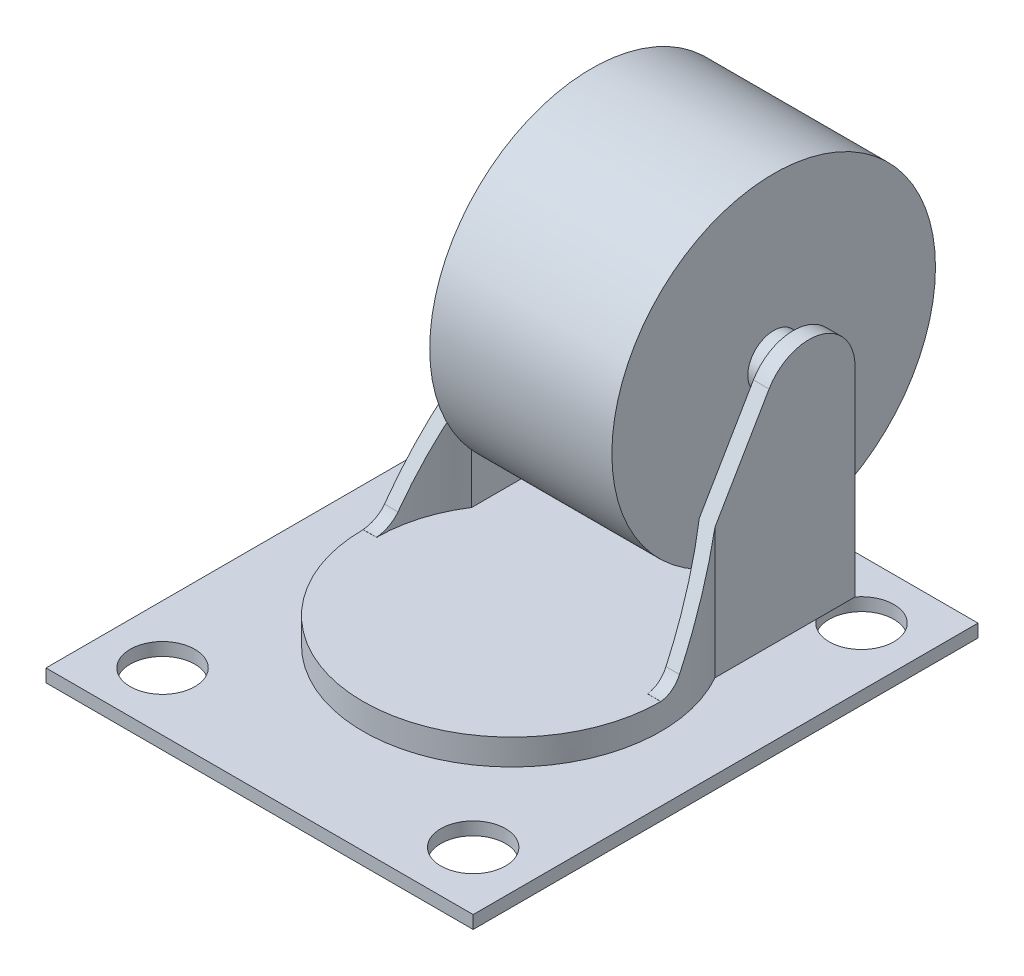
ISO-10303-21;
HEADER;
FILE_DESCRIPTION(('STEP AP214'),'2;1');
FILE_NAME('part.step','',(''),(''),'','','');
FILE_SCHEMA(('AUTOMOTIVE_DESIGN { 1 0 10303 214 1 1 1 1 }'));
ENDSEC;
DATA;
#1=APPLICATION_CONTEXT('core data for automotive mechanical design processes');
#2=APPLICATION_PROTOCOL_DEFINITION('international standard','automotive_design',2000,#1);
#3=PRODUCT_CONTEXT('',#1,'mechanical');
#4=PRODUCT('Part','Part','',(#3));
#5=PRODUCT_RELATED_PRODUCT_CATEGORY('part','',(#4));
#6=PRODUCT_DEFINITION_FORMATION('','',#4);
#7=PRODUCT_DEFINITION_CONTEXT('part definition',#1,'design');
#8=PRODUCT_DEFINITION('design','',#6,#7);
#9=PRODUCT_DEFINITION_SHAPE('','',#8);
#10=(LENGTH_UNIT() NAMED_UNIT(*) SI_UNIT(.MILLI.,.METRE.));
#11=(NAMED_UNIT(*) PLANE_ANGLE_UNIT() SI_UNIT($,.RADIAN.));
#12=(NAMED_UNIT(*) SI_UNIT($,.STERADIAN.) SOLID_ANGLE_UNIT());
#13=UNCERTAINTY_MEASURE_WITH_UNIT(LENGTH_MEASURE(1.E-05),#10,'distance_accuracy_value','');
#14=(GEOMETRIC_REPRESENTATION_CONTEXT(3) GLOBAL_UNCERTAINTY_ASSIGNED_CONTEXT((#13)) GLOBAL_UNIT_ASSIGNED_CONTEXT((#10,
#11,#12)) REPRESENTATION_CONTEXT('',''));
#15=CARTESIAN_POINT('',(0.,0.,0.));
#16=DIRECTION('',(0.,0.,1.));
#17=DIRECTION('',(1.,0.,0.));
#18=AXIS2_PLACEMENT_3D('',#15,#16,#17);
#19=CARTESIAN_POINT('',(-9.99999999999999,3.,-5.67890834580028));
#20=DIRECTION('',(1.,0.,0.));
#21=DIRECTION('',(0.,0.,-1.));
#22=AXIS2_PLACEMENT_3D('',#19,#20,#21);
#23=PLANE('',#22);
#24=CARTESIAN_POINT('',(-9.99999999999999,16.4364907092457,-12.9364907092474));
#25=DIRECTION('',(1.,0.,0.));
#26=DIRECTION('',(0.,0.,-1.));
#27=AXIS2_PLACEMENT_3D('',#24,#25,#26);
#28=CIRCLE('',#27,3.56350929075368);
#29=CARTESIAN_POINT('',(-10.0000000000001,16.4364907092457,-16.5000000000011));
#30=VERTEX_POINT('',#29);
#31=CARTESIAN_POINT('',(-9.99999999999999,18.2335634900353,-9.85929590133667));
#32=VERTEX_POINT('',#31);
#33=EDGE_CURVE('E184',#30,#32,#28,.T.);
#34=ORIENTED_EDGE('',*,*,#33,.F.);
#35=DIRECTION('',(0.,-1.,0.));
#36=VECTOR('',#35,1.);
#37=CARTESIAN_POINT('',(-9.99999999999999,3.,-16.5));
#38=LINE('',#37,#36);
#39=CARTESIAN_POINT('',(-10.0000000000001,1.,-16.5));
#40=VERTEX_POINT('',#39);
#41=EDGE_CURVE('E197',#30,#40,#38,.T.);
#42=ORIENTED_EDGE('',*,*,#41,.T.);
#43=DIRECTION('',(0.,0.,1.));
#44=VECTOR('',#43,1.);
#45=CARTESIAN_POINT('',(-9.99999999999999,1.,-5.67890834580028));
#46=LINE('',#45,#44);
#47=CARTESIAN_POINT('',(-9.99999999999999,1.,-13.4999999999998));
#48=VERTEX_POINT('',#47);
#49=EDGE_CURVE('E708',#40,#48,#46,.T.);
#50=ORIENTED_EDGE('',*,*,#49,.T.);
#51=CARTESIAN_POINT('',(-9.99999999999999,1.,-5.67890834580029));
#52=VERTEX_POINT('',#51);
#53=EDGE_CURVE('E279',#48,#52,#46,.T.);
#54=ORIENTED_EDGE('',*,*,#53,.T.);
#55=DIRECTION('',(0.,-1.,0.));
#56=VECTOR('',#55,1.);
#57=CARTESIAN_POINT('',(-9.99999999999999,3.,-5.67890834580029));
#58=LINE('',#57,#56);
#59=CARTESIAN_POINT('',(-9.99999999999999,11.0753298233394,-5.67890834580029));
#60=VERTEX_POINT('',#59);
#61=EDGE_CURVE('E219',#60,#52,#58,.T.);
#62=ORIENTED_EDGE('',*,*,#61,.F.);
#63=DIRECTION('',(0.,0.863529334943845,-0.504298609646547));
#64=VECTOR('',#63,1.);
#65=CARTESIAN_POINT('',(-9.99999999999999,5.0536943628195,-2.16229082320507));
#66=LINE('',#65,#64);
#67=EDGE_CURVE('E200',#60,#32,#66,.T.);
#68=ORIENTED_EDGE('',*,*,#67,.T.);
#69=EDGE_LOOP('',(#34,#42,#50,#54,#62,#68));
#70=FACE_BOUND('',#69,.T.);
#71=ADVANCED_FACE('F36',(#70),#23,.F.);
#72=CARTESIAN_POINT('',(10.,3.,-5.67890834580026));
#73=DIRECTION('',(-1.,0.,0.));
#74=DIRECTION('',(0.,0.,1.));
#75=AXIS2_PLACEMENT_3D('',#72,#73,#74);
#76=PLANE('',#75);
#77=DIRECTION('',(0.,-1.,0.));
#78=VECTOR('',#77,1.);
#79=CARTESIAN_POINT('',(10.,3.,-16.5));
#80=LINE('',#79,#78);
#81=CARTESIAN_POINT('',(10.,16.4364907092457,-16.5000000000011));
#82=VERTEX_POINT('',#81);
#83=CARTESIAN_POINT('',(10.,1.,-16.5));
#84=VERTEX_POINT('',#83);
#85=EDGE_CURVE('E208',#82,#84,#80,.T.);
#86=ORIENTED_EDGE('',*,*,#85,.F.);
#87=CARTESIAN_POINT('',(10.,16.4364907092457,-12.9364907092474));
#88=DIRECTION('',(-1.,0.,0.));
#89=DIRECTION('',(0.,0.,1.));
#90=AXIS2_PLACEMENT_3D('',#87,#88,#89);
#91=CIRCLE('',#90,3.56350929075368);
#92=CARTESIAN_POINT('',(10.,18.2335634900353,-9.85929590133667));
#93=VERTEX_POINT('',#92);
#94=EDGE_CURVE('E191',#93,#82,#91,.T.);
#95=ORIENTED_EDGE('',*,*,#94,.F.);
#96=DIRECTION('',(0.,-0.863529334943845,0.504298609646547));
#97=VECTOR('',#96,1.);
#98=CARTESIAN_POINT('',(10.,5.05369436281949,-2.16229082320507));
#99=LINE('',#98,#97);
#100=CARTESIAN_POINT('',(10.,11.0753298233393,-5.67890834580026));
#101=VERTEX_POINT('',#100);
#102=EDGE_CURVE('E735',#93,#101,#99,.T.);
#103=ORIENTED_EDGE('',*,*,#102,.T.);
#104=DIRECTION('',(0.,-1.,0.));
#105=VECTOR('',#104,1.);
#106=CARTESIAN_POINT('',(10.,3.,-5.67890834580026));
#107=LINE('',#106,#105);
#108=CARTESIAN_POINT('',(10.,1.,-5.67890834580026));
#109=VERTEX_POINT('',#108);
#110=EDGE_CURVE('E211',#101,#109,#107,.T.);
#111=ORIENTED_EDGE('',*,*,#110,.T.);
#112=DIRECTION('',(0.,0.,-1.));
#113=VECTOR('',#112,1.);
#114=CARTESIAN_POINT('',(10.,1.,-5.67890834580026));
#115=LINE('',#114,#113);
#116=CARTESIAN_POINT('',(10.,1.,-13.5));
#117=VERTEX_POINT('',#116);
#118=EDGE_CURVE('E713',#109,#117,#115,.T.);
#119=ORIENTED_EDGE('',*,*,#118,.T.);
#120=EDGE_CURVE('E712',#117,#84,#115,.T.);
#121=ORIENTED_EDGE('',*,*,#120,.T.);
#122=EDGE_LOOP('',(#86,#95,#103,#111,#119,#121));
#123=FACE_BOUND('',#122,.T.);
#124=ADVANCED_FACE('F346',(#123),#76,.F.);
#125=CARTESIAN_POINT('',(-8.79173124750535,-13.7207870519226,-16.5));
#126=DIRECTION('',(1.,0.,0.));
#127=DIRECTION('',(0.,0.,-1.));
#128=AXIS2_PLACEMENT_3D('',#125,#126,#127);
#129=PLANE('',#128);
#130=CARTESIAN_POINT('',(-8.79173124750535,17.,-13.1796479506689));
#131=DIRECTION('',(1.,0.,0.));
#132=DIRECTION('',(0.,0.,-1.));
#133=AXIS2_PLACEMENT_3D('',#130,#131,#132);
#134=CIRCLE('',#133,2.);
#135=CARTESIAN_POINT('',(-8.79173124750535,17.,-15.1796479506689));
#136=VERTEX_POINT('',#135);
#137=EDGE_CURVE('E681',#136,#136,#134,.T.);
#138=ORIENTED_EDGE('',*,*,#137,.F.);
#139=EDGE_LOOP('',(#138));
#140=FACE_BOUND('',#139,.T.);
#141=DIRECTION('',(0.,1.,0.));
#142=VECTOR('',#141,1.);
#143=CARTESIAN_POINT('',(-8.79173124750535,-13.7207870519226,-16.5));
#144=LINE('',#143,#142);
#145=CARTESIAN_POINT('',(-8.79173124750535,3.,-16.5));
#146=VERTEX_POINT('',#145);
#147=CARTESIAN_POINT('',(-8.79173124750535,16.4364907092457,-16.5000000000011));
#148=VERTEX_POINT('',#147);
#149=EDGE_CURVE('E683',#146,#148,#144,.T.);
#150=ORIENTED_EDGE('',*,*,#149,.T.);
#151=CARTESIAN_POINT('',(-8.79173124750535,16.4364907092457,-12.9364907092474));
#152=DIRECTION('',(1.,0.,0.));
#153=DIRECTION('',(0.,0.,-1.));
#154=AXIS2_PLACEMENT_3D('',#151,#152,#153);
#155=CIRCLE('',#154,3.56350929075368);
#156=CARTESIAN_POINT('',(-8.79173124750535,18.2335634900353,-9.85929590133667));
#157=VERTEX_POINT('',#156);
#158=EDGE_CURVE('E186',#148,#157,#155,.T.);
#159=ORIENTED_EDGE('',*,*,#158,.T.);
#160=DIRECTION('',(0.,0.863529334943845,-0.504298609646547));
#161=VECTOR('',#160,1.);
#162=CARTESIAN_POINT('',(-8.79173124750535,-2.7023781549703,2.36723287536569));
#163=LINE('',#162,#161);
#164=CARTESIAN_POINT('',(-8.79173124750535,11.0753298233394,-5.67890834580029));
#165=VERTEX_POINT('',#164);
#166=EDGE_CURVE('E779',#165,#157,#163,.T.);
#167=ORIENTED_EDGE('',*,*,#166,.F.);
#168=DIRECTION('',(0.,1.,0.));
#169=VECTOR('',#168,1.);
#170=CARTESIAN_POINT('',(-8.79173124750535,-13.7207870519226,-5.67890834580029));
#171=LINE('',#170,#169);
#172=CARTESIAN_POINT('',(-8.79173124750535,3.,-5.67890834580029));
#173=VERTEX_POINT('',#172);
#174=EDGE_CURVE('E690',#173,#165,#171,.T.);
#175=ORIENTED_EDGE('',*,*,#174,.F.);
#176=DIRECTION('',(0.,0.,1.));
#177=VECTOR('',#176,1.);
#178=CARTESIAN_POINT('',(-8.79173124750535,3.,-16.5));
#179=LINE('',#178,#177);
#180=EDGE_CURVE('E688',#146,#173,#179,.T.);
#181=ORIENTED_EDGE('',*,*,#180,.F.);
#182=EDGE_LOOP('',(#150,#159,#167,#175,#181));
#183=FACE_BOUND('',#182,.T.);
#184=ADVANCED_FACE('F329',(#140,#183),#129,.T.);
#185=CARTESIAN_POINT('',(8.79173124750535,-13.7207870519226,-16.5));
#186=DIRECTION('',(-1.,0.,0.));
#187=DIRECTION('',(0.,0.,1.));
#188=AXIS2_PLACEMENT_3D('',#185,#186,#187);
#189=PLANE('',#188);
#190=CARTESIAN_POINT('',(8.79173124750535,17.,-13.1796479506689));
#191=DIRECTION('',(-1.,0.,0.));
#192=DIRECTION('',(0.,0.,1.));
#193=AXIS2_PLACEMENT_3D('',#190,#191,#192);
#194=CIRCLE('',#193,2.);
#195=CARTESIAN_POINT('',(8.79173124750535,17.,-11.1796479506689));
#196=VERTEX_POINT('',#195);
#197=EDGE_CURVE('E11',#196,#196,#194,.T.);
#198=ORIENTED_EDGE('',*,*,#197,.F.);
#199=EDGE_LOOP('',(#198));
#200=FACE_BOUND('',#199,.T.);
#201=DIRECTION('',(0.,-0.863529334943845,0.504298609646547));
#202=VECTOR('',#201,1.);
#203=CARTESIAN_POINT('',(8.79173124750535,-2.7023781549703,2.36723287536569));
#204=LINE('',#203,#202);
#205=CARTESIAN_POINT('',(8.79173124750535,18.2335634900353,-9.85929590133667));
#206=VERTEX_POINT('',#205);
#207=CARTESIAN_POINT('',(8.79173124750535,11.0753298233394,-5.67890834580029));
#208=VERTEX_POINT('',#207);
#209=EDGE_CURVE('E280',#206,#208,#204,.T.);
#210=ORIENTED_EDGE('',*,*,#209,.F.);
#211=CARTESIAN_POINT('',(8.79173124750535,16.4364907092457,-12.9364907092474));
#212=DIRECTION('',(-1.,0.,0.));
#213=DIRECTION('',(0.,0.,1.));
#214=AXIS2_PLACEMENT_3D('',#211,#212,#213);
#215=CIRCLE('',#214,3.56350929075368);
#216=CARTESIAN_POINT('',(8.79173124750535,16.4364907092457,-16.5000000000011));
#217=VERTEX_POINT('',#216);
#218=EDGE_CURVE('E59',#206,#217,#215,.T.);
#219=ORIENTED_EDGE('',*,*,#218,.T.);
#220=DIRECTION('',(0.,1.,0.));
#221=VECTOR('',#220,1.);
#222=CARTESIAN_POINT('',(8.79173124750535,-13.7207870519226,-16.5));
#223=LINE('',#222,#221);
#224=CARTESIAN_POINT('',(8.79173124750535,3.,-16.5));
#225=VERTEX_POINT('',#224);
#226=EDGE_CURVE('E763',#225,#217,#223,.T.);
#227=ORIENTED_EDGE('',*,*,#226,.F.);
#228=DIRECTION('',(0.,0.,-1.));
#229=VECTOR('',#228,1.);
#230=CARTESIAN_POINT('',(8.79173124750535,3.,-16.5));
#231=LINE('',#230,#229);
#232=CARTESIAN_POINT('',(8.79173124750535,3.,-5.67890834580029));
#233=VERTEX_POINT('',#232);
#234=EDGE_CURVE('E750',#233,#225,#231,.T.);
#235=ORIENTED_EDGE('',*,*,#234,.F.);
#236=DIRECTION('',(0.,1.,0.));
#237=VECTOR('',#236,1.);
#238=CARTESIAN_POINT('',(8.79173124750535,-13.7207870519226,-5.67890834580029));
#239=LINE('',#238,#237);
#240=EDGE_CURVE('E756',#233,#208,#239,.T.);
#241=ORIENTED_EDGE('',*,*,#240,.T.);
#242=EDGE_LOOP('',(#210,#219,#227,#235,#241));
#243=FACE_BOUND('',#242,.T.);
#244=ADVANCED_FACE('F337',(#200,#243),#189,.T.);
#245=CARTESIAN_POINT('',(0.,3.,0.));
#246=DIRECTION('',(0.,1.,0.));
#247=DIRECTION('',(0.,0.,1.));
#248=AXIS2_PLACEMENT_3D('',#245,#246,#247);
#249=PLANE('',#248);
#250=CARTESIAN_POINT('',(0.,3.,0.));
#251=DIRECTION('',(0.,1.,0.));
#252=DIRECTION('',(0.,0.,1.));
#253=AXIS2_PLACEMENT_3D('',#250,#251,#252);
#254=CIRCLE('',#253,11.5);
#255=CARTESIAN_POINT('',(-11.5,3.,0.));
#256=VERTEX_POINT('',#255);
#257=CARTESIAN_POINT('',(11.5,3.,0.));
#258=VERTEX_POINT('',#257);
#259=EDGE_CURVE('E213',#256,#258,#254,.T.);
#260=ORIENTED_EDGE('',*,*,#259,.T.);
#261=DIRECTION('',(-1.,0.,0.));
#262=VECTOR('',#261,1.);
#263=CARTESIAN_POINT('',(10.4663526755199,3.,0.));
#264=LINE('',#263,#262);
#265=CARTESIAN_POINT('',(10.4663526755199,3.,0.));
#266=VERTEX_POINT('',#265);
#267=EDGE_CURVE('E706',#258,#266,#264,.T.);
#268=ORIENTED_EDGE('',*,*,#267,.T.);
#269=CARTESIAN_POINT('',(0.,3.,0.));
#270=DIRECTION('',(0.,1.,0.));
#271=DIRECTION('',(0.,0.,1.));
#272=AXIS2_PLACEMENT_3D('',#269,#270,#271);
#273=CIRCLE('',#272,10.4663526755199);
#274=EDGE_CURVE('E754',#266,#233,#273,.T.);
#275=ORIENTED_EDGE('',*,*,#274,.T.);
#276=ORIENTED_EDGE('',*,*,#234,.T.);
#277=DIRECTION('',(-1.,0.,0.));
#278=VECTOR('',#277,1.);
#279=CARTESIAN_POINT('',(10.,3.,-16.5));
#280=LINE('',#279,#278);
#281=EDGE_CURVE('E209',#225,#146,#280,.T.);
#282=ORIENTED_EDGE('',*,*,#281,.T.);
#283=ORIENTED_EDGE('',*,*,#180,.T.);
#284=CARTESIAN_POINT('',(0.,3.,0.));
#285=DIRECTION('',(0.,1.,0.));
#286=DIRECTION('',(0.,0.,1.));
#287=AXIS2_PLACEMENT_3D('',#284,#285,#286);
#288=CIRCLE('',#287,10.4663526755199);
#289=CARTESIAN_POINT('',(-10.4663526755199,3.,0.));
#290=VERTEX_POINT('',#289);
#291=EDGE_CURVE('E693',#173,#290,#288,.T.);
#292=ORIENTED_EDGE('',*,*,#291,.T.);
#293=DIRECTION('',(-1.,0.,0.));
#294=VECTOR('',#293,1.);
#295=CARTESIAN_POINT('',(-10.4663526755199,3.,0.));
#296=LINE('',#295,#294);
#297=EDGE_CURVE('E689',#290,#256,#296,.T.);
#298=ORIENTED_EDGE('',*,*,#297,.T.);
#299=EDGE_LOOP('',(#260,#268,#275,#276,#282,#283,#292,#298));
#300=FACE_BOUND('',#299,.T.);
#301=ADVANCED_FACE('F333',(#300),#249,.T.);
#302=CARTESIAN_POINT('',(-16.5,1.,0.));
#303=DIRECTION('',(-1.,0.,0.));
#304=DIRECTION('',(0.,0.,1.));
#305=AXIS2_PLACEMENT_3D('',#302,#303,#304);
#306=PLANE('',#305);
#307=DIRECTION('',(0.,0.,-1.));
#308=VECTOR('',#307,1.);
#309=CARTESIAN_POINT('',(-16.5,0.,0.));
#310=LINE('',#309,#308);
#311=CARTESIAN_POINT('',(-16.5,0.,19.5));
#312=VERTEX_POINT('',#311);
#313=CARTESIAN_POINT('',(-16.5,0.,-19.5));
#314=VERTEX_POINT('',#313);
#315=EDGE_CURVE('E260',#312,#314,#310,.T.);
#316=ORIENTED_EDGE('',*,*,#315,.F.);
#317=DIRECTION('',(0.,-1.,0.));
#318=VECTOR('',#317,1.);
#319=CARTESIAN_POINT('',(-16.5,1.,19.5));
#320=LINE('',#319,#318);
#321=CARTESIAN_POINT('',(-16.5,1.,19.5));
#322=VERTEX_POINT('',#321);
#323=EDGE_CURVE('E277',#322,#312,#320,.T.);
#324=ORIENTED_EDGE('',*,*,#323,.F.);
#325=DIRECTION('',(0.,0.,-1.));
#326=VECTOR('',#325,1.);
#327=CARTESIAN_POINT('',(-16.5,1.,0.));
#328=LINE('',#327,#326);
#329=CARTESIAN_POINT('',(-16.5,1.,-19.5));
#330=VERTEX_POINT('',#329);
#331=EDGE_CURVE('E237',#322,#330,#328,.T.);
#332=ORIENTED_EDGE('',*,*,#331,.T.);
#333=DIRECTION('',(0.,-1.,0.));
#334=VECTOR('',#333,1.);
#335=CARTESIAN_POINT('',(-16.5,1.,-19.5));
#336=LINE('',#335,#334);
#337=EDGE_CURVE('E248',#330,#314,#336,.T.);
#338=ORIENTED_EDGE('',*,*,#337,.T.);
#339=EDGE_LOOP('',(#316,#324,#332,#338));
#340=FACE_BOUND('',#339,.T.);
#341=ADVANCED_FACE('F336',(#340),#306,.T.);
#342=CARTESIAN_POINT('',(0.,1.,19.5));
#343=DIRECTION('',(0.,0.,-1.));
#344=DIRECTION('',(-1.,0.,0.));
#345=AXIS2_PLACEMENT_3D('',#342,#343,#344);
#346=PLANE('',#345);
#347=DIRECTION('',(1.,0.,0.));
#348=VECTOR('',#347,1.);
#349=CARTESIAN_POINT('',(0.,0.,19.5));
#350=LINE('',#349,#348);
#351=CARTESIAN_POINT('',(16.5,0.,19.5));
#352=VERTEX_POINT('',#351);
#353=EDGE_CURVE('E263',#312,#352,#350,.T.);
#354=ORIENTED_EDGE('',*,*,#353,.T.);
#355=DIRECTION('',(0.,-1.,0.));
#356=VECTOR('',#355,1.);
#357=CARTESIAN_POINT('',(16.5,1.,19.5));
#358=LINE('',#357,#356);
#359=CARTESIAN_POINT('',(16.5,1.,19.5));
#360=VERTEX_POINT('',#359);
#361=EDGE_CURVE('E274',#360,#352,#358,.T.);
#362=ORIENTED_EDGE('',*,*,#361,.F.);
#363=DIRECTION('',(1.,0.,0.));
#364=VECTOR('',#363,1.);
#365=CARTESIAN_POINT('',(0.,1.,19.5));
#366=LINE('',#365,#364);
#367=EDGE_CURVE('E240',#322,#360,#366,.T.);
#368=ORIENTED_EDGE('',*,*,#367,.F.);
#369=ORIENTED_EDGE('',*,*,#323,.T.);
#370=EDGE_LOOP('',(#354,#362,#368,#369));
#371=FACE_BOUND('',#370,.T.);
#372=ADVANCED_FACE('F372',(#371),#346,.F.);
#373=CARTESIAN_POINT('',(16.5,1.,0.));
#374=DIRECTION('',(-1.,0.,0.));
#375=DIRECTION('',(0.,0.,1.));
#376=AXIS2_PLACEMENT_3D('',#373,#374,#375);
#377=PLANE('',#376);
#378=DIRECTION('',(0.,0.,-1.));
#379=VECTOR('',#378,1.);
#380=CARTESIAN_POINT('',(16.5,0.,0.));
#381=LINE('',#380,#379);
#382=CARTESIAN_POINT('',(16.5,0.,-19.5));
#383=VERTEX_POINT('',#382);
#384=EDGE_CURVE('E266',#352,#383,#381,.T.);
#385=ORIENTED_EDGE('',*,*,#384,.T.);
#386=DIRECTION('',(0.,-1.,0.));
#387=VECTOR('',#386,1.);
#388=CARTESIAN_POINT('',(16.5,1.,-19.5));
#389=LINE('',#388,#387);
#390=CARTESIAN_POINT('',(16.5,1.,-19.5));
#391=VERTEX_POINT('',#390);
#392=EDGE_CURVE('E272',#391,#383,#389,.T.);
#393=ORIENTED_EDGE('',*,*,#392,.F.);
#394=DIRECTION('',(0.,0.,-1.));
#395=VECTOR('',#394,1.);
#396=CARTESIAN_POINT('',(16.5,1.,0.));
#397=LINE('',#396,#395);
#398=EDGE_CURVE('E243',#360,#391,#397,.T.);
#399=ORIENTED_EDGE('',*,*,#398,.F.);
#400=ORIENTED_EDGE('',*,*,#361,.T.);
#401=EDGE_LOOP('',(#385,#393,#399,#400));
#402=FACE_BOUND('',#401,.T.);
#403=ADVANCED_FACE('F368',(#402),#377,.F.);
#404=CARTESIAN_POINT('',(12.,1.,-15.));
#405=DIRECTION('',(0.,-1.,0.));
#406=DIRECTION('',(0.,0.,-1.));
#407=AXIS2_PLACEMENT_3D('',#404,#405,#406);
#408=CYLINDRICAL_SURFACE('',#407,2.5);
#409=CARTESIAN_POINT('',(12.,1.,-15.));
#410=DIRECTION('',(0.,1.,0.));
#411=DIRECTION('',(0.,0.,1.));
#412=AXIS2_PLACEMENT_3D('',#409,#410,#411);
#413=CIRCLE('',#412,2.5);
#414=EDGE_CURVE('E234',#84,#117,#413,.T.);
#415=ORIENTED_EDGE('',*,*,#414,.T.);
#416=EDGE_CURVE('E233',#117,#84,#413,.T.);
#417=ORIENTED_EDGE('',*,*,#416,.T.);
#418=EDGE_LOOP('',(#415,#417));
#419=FACE_BOUND('',#418,.T.);
#420=CARTESIAN_POINT('',(12.,0.,-15.));
#421=DIRECTION('',(0.,1.,0.));
#422=DIRECTION('',(0.,0.,1.));
#423=AXIS2_PLACEMENT_3D('',#420,#421,#422);
#424=CIRCLE('',#423,2.5);
#425=CARTESIAN_POINT('',(12.,0.,-12.5));
#426=VERTEX_POINT('',#425);
#427=EDGE_CURVE('E257',#426,#426,#424,.T.);
#428=ORIENTED_EDGE('',*,*,#427,.F.);
#429=EDGE_LOOP('',(#428));
#430=FACE_BOUND('',#429,.T.);
#431=ADVANCED_FACE('F371',(#419,#430),#408,.F.);
#432=CARTESIAN_POINT('',(-12.,1.,-14.9999999999998));
#433=DIRECTION('',(0.,-1.,0.));
#434=DIRECTION('',(0.,0.,-1.));
#435=AXIS2_PLACEMENT_3D('',#432,#433,#434);
#436=CYLINDRICAL_SURFACE('',#435,2.5);
#437=CARTESIAN_POINT('',(-12.,1.,-14.9999999999998));
#438=DIRECTION('',(0.,1.,0.));
#439=DIRECTION('',(0.,0.,1.));
#440=AXIS2_PLACEMENT_3D('',#437,#438,#439);
#441=CIRCLE('',#440,2.5);
#442=EDGE_CURVE('E230',#48,#40,#441,.T.);
#443=ORIENTED_EDGE('',*,*,#442,.T.);
#444=EDGE_CURVE('E229',#40,#48,#441,.T.);
#445=ORIENTED_EDGE('',*,*,#444,.T.);
#446=EDGE_LOOP('',(#443,#445));
#447=FACE_BOUND('',#446,.T.);
#448=CARTESIAN_POINT('',(-12.,0.,-14.9999999999998));
#449=DIRECTION('',(0.,1.,0.));
#450=DIRECTION('',(0.,0.,1.));
#451=AXIS2_PLACEMENT_3D('',#448,#449,#450);
#452=CIRCLE('',#451,2.5);
#453=CARTESIAN_POINT('',(-12.,0.,-12.4999999999998));
#454=VERTEX_POINT('',#453);
#455=EDGE_CURVE('E254',#454,#454,#452,.T.);
#456=ORIENTED_EDGE('',*,*,#455,.F.);
#457=EDGE_LOOP('',(#456));
#458=FACE_BOUND('',#457,.T.);
#459=ADVANCED_FACE('F382',(#447,#458),#436,.F.);
#460=CARTESIAN_POINT('',(-11.9999999999997,1.,15.0000000000002));
#461=DIRECTION('',(0.,-1.,0.));
#462=DIRECTION('',(0.,0.,-1.));
#463=AXIS2_PLACEMENT_3D('',#460,#461,#462);
#464=CYLINDRICAL_SURFACE('',#463,2.5);
#465=CARTESIAN_POINT('',(-11.9999999999997,1.,15.0000000000002));
#466=DIRECTION('',(0.,1.,0.));
#467=DIRECTION('',(0.,0.,1.));
#468=AXIS2_PLACEMENT_3D('',#465,#466,#467);
#469=CIRCLE('',#468,2.5);
#470=CARTESIAN_POINT('',(-11.9999999999997,1.,17.5000000000002));
#471=VERTEX_POINT('',#470);
#472=EDGE_CURVE('E225',#471,#471,#469,.T.);
#473=ORIENTED_EDGE('',*,*,#472,.T.);
#474=EDGE_LOOP('',(#473));
#475=FACE_BOUND('',#474,.T.);
#476=CARTESIAN_POINT('',(-11.9999999999997,0.,15.0000000000002));
#477=DIRECTION('',(0.,1.,0.));
#478=DIRECTION('',(0.,0.,1.));
#479=AXIS2_PLACEMENT_3D('',#476,#477,#478);
#480=CIRCLE('',#479,2.5);
#481=CARTESIAN_POINT('',(-11.9999999999997,0.,17.5000000000002));
#482=VERTEX_POINT('',#481);
#483=EDGE_CURVE('E251',#482,#482,#480,.T.);
#484=ORIENTED_EDGE('',*,*,#483,.F.);
#485=EDGE_LOOP('',(#484));
#486=FACE_BOUND('',#485,.T.);
#487=ADVANCED_FACE('F385',(#475,#486),#464,.F.);
#488=CARTESIAN_POINT('',(12.0000000000003,1.,15.));
#489=DIRECTION('',(0.,-1.,0.));
#490=DIRECTION('',(0.,0.,-1.));
#491=AXIS2_PLACEMENT_3D('',#488,#489,#490);
#492=CYLINDRICAL_SURFACE('',#491,2.5);
#493=CARTESIAN_POINT('',(12.0000000000003,1.,15.));
#494=DIRECTION('',(0.,1.,0.));
#495=DIRECTION('',(0.,0.,1.));
#496=AXIS2_PLACEMENT_3D('',#493,#494,#495);
#497=CIRCLE('',#496,2.5);
#498=CARTESIAN_POINT('',(12.0000000000003,1.,17.5));
#499=VERTEX_POINT('',#498);
#500=EDGE_CURVE('E222',#499,#499,#497,.T.);
#501=ORIENTED_EDGE('',*,*,#500,.T.);
#502=EDGE_LOOP('',(#501));
#503=FACE_BOUND('',#502,.T.);
#504=CARTESIAN_POINT('',(12.0000000000003,0.,15.));
#505=DIRECTION('',(0.,1.,0.));
#506=DIRECTION('',(0.,0.,1.));
#507=AXIS2_PLACEMENT_3D('',#504,#505,#506);
#508=CIRCLE('',#507,2.5);
#509=CARTESIAN_POINT('',(12.0000000000003,0.,17.5));
#510=VERTEX_POINT('',#509);
#511=EDGE_CURVE('E221',#510,#510,#508,.T.);
#512=ORIENTED_EDGE('',*,*,#511,.F.);
#513=EDGE_LOOP('',(#512));
#514=FACE_BOUND('',#513,.T.);
#515=ADVANCED_FACE('F38',(#503,#514),#492,.F.);
#516=CARTESIAN_POINT('',(0.,1.,-19.5));
#517=DIRECTION('',(0.,0.,-1.));
#518=DIRECTION('',(-1.,0.,0.));
#519=AXIS2_PLACEMENT_3D('',#516,#517,#518);
#520=PLANE('',#519);
#521=DIRECTION('',(1.,0.,0.));
#522=VECTOR('',#521,1.);
#523=CARTESIAN_POINT('',(0.,0.,-19.5));
#524=LINE('',#523,#522);
#525=EDGE_CURVE('E226',#314,#383,#524,.T.);
#526=ORIENTED_EDGE('',*,*,#525,.F.);
#527=ORIENTED_EDGE('',*,*,#337,.F.);
#528=DIRECTION('',(1.,0.,0.));
#529=VECTOR('',#528,1.);
#530=CARTESIAN_POINT('',(0.,1.,-19.5));
#531=LINE('',#530,#529);
#532=EDGE_CURVE('E245',#330,#391,#531,.T.);
#533=ORIENTED_EDGE('',*,*,#532,.T.);
#534=ORIENTED_EDGE('',*,*,#392,.T.);
#535=EDGE_LOOP('',(#526,#527,#533,#534));
#536=FACE_BOUND('',#535,.T.);
#537=ADVANCED_FACE('F360',(#536),#520,.T.);
#538=CARTESIAN_POINT('',(0.,1.,0.));
#539=DIRECTION('',(0.,1.,0.));
#540=DIRECTION('',(0.,0.,1.));
#541=AXIS2_PLACEMENT_3D('',#538,#539,#540);
#542=PLANE('',#541);
#543=DIRECTION('',(-1.,0.,0.));
#544=VECTOR('',#543,1.);
#545=CARTESIAN_POINT('',(10.,1.,-16.5));
#546=LINE('',#545,#544);
#547=EDGE_CURVE('E206',#84,#40,#546,.T.);
#548=ORIENTED_EDGE('',*,*,#547,.F.);
#549=ORIENTED_EDGE('',*,*,#416,.F.);
#550=ORIENTED_EDGE('',*,*,#118,.F.);
#551=CARTESIAN_POINT('',(0.,1.,0.));
#552=DIRECTION('',(0.,1.,0.));
#553=DIRECTION('',(0.,0.,1.));
#554=AXIS2_PLACEMENT_3D('',#551,#552,#553);
#555=CIRCLE('',#554,11.5);
#556=EDGE_CURVE('E710',#52,#109,#555,.T.);
#557=ORIENTED_EDGE('',*,*,#556,.F.);
#558=ORIENTED_EDGE('',*,*,#53,.F.);
#559=ORIENTED_EDGE('',*,*,#444,.F.);
#560=EDGE_LOOP('',(#548,#549,#550,#557,#558,#559));
#561=FACE_BOUND('',#560,.T.);
#562=ORIENTED_EDGE('',*,*,#500,.F.);
#563=EDGE_LOOP('',(#562));
#564=FACE_BOUND('',#563,.T.);
#565=ORIENTED_EDGE('',*,*,#472,.F.);
#566=EDGE_LOOP('',(#565));
#567=FACE_BOUND('',#566,.T.);
#568=ORIENTED_EDGE('',*,*,#331,.F.);
#569=ORIENTED_EDGE('',*,*,#367,.T.);
#570=ORIENTED_EDGE('',*,*,#398,.T.);
#571=ORIENTED_EDGE('',*,*,#532,.F.);
#572=EDGE_LOOP('',(#568,#569,#570,#571));
#573=FACE_BOUND('',#572,.T.);
#574=ADVANCED_FACE('F356',(#561,#564,#567,#573),#542,.T.);
#575=CARTESIAN_POINT('',(0.,0.,0.));
#576=DIRECTION('',(0.,1.,0.));
#577=DIRECTION('',(0.,0.,1.));
#578=AXIS2_PLACEMENT_3D('',#575,#576,#577);
#579=PLANE('',#578);
#580=ORIENTED_EDGE('',*,*,#511,.T.);
#581=EDGE_LOOP('',(#580));
#582=FACE_BOUND('',#581,.T.);
#583=ORIENTED_EDGE('',*,*,#483,.T.);
#584=EDGE_LOOP('',(#583));
#585=FACE_BOUND('',#584,.T.);
#586=ORIENTED_EDGE('',*,*,#455,.T.);
#587=EDGE_LOOP('',(#586));
#588=FACE_BOUND('',#587,.T.);
#589=ORIENTED_EDGE('',*,*,#427,.T.);
#590=EDGE_LOOP('',(#589));
#591=FACE_BOUND('',#590,.T.);
#592=ORIENTED_EDGE('',*,*,#315,.T.);
#593=ORIENTED_EDGE('',*,*,#525,.T.);
#594=ORIENTED_EDGE('',*,*,#384,.F.);
#595=ORIENTED_EDGE('',*,*,#353,.F.);
#596=EDGE_LOOP('',(#592,#593,#594,#595));
#597=FACE_BOUND('',#596,.T.);
#598=ADVANCED_FACE('F359',(#582,#585,#588,#591,#597),#579,.F.);
#599=CARTESIAN_POINT('',(0.,1.,0.));
#600=DIRECTION('',(0.,1.,0.));
#601=DIRECTION('',(0.,0.,1.));
#602=AXIS2_PLACEMENT_3D('',#599,#600,#601);
#603=PLANE('',#602);
#604=ORIENTED_EDGE('',*,*,#442,.F.);
#605=ORIENTED_EDGE('',*,*,#49,.F.);
#606=EDGE_LOOP('',(#604,#605));
#607=FACE_BOUND('',#606,.T.);
#608=ADVANCED_FACE('F342',(#607),#603,.F.);
#609=CARTESIAN_POINT('',(0.,3.,0.));
#610=DIRECTION('',(0.,-1.,0.));
#611=DIRECTION('',(0.,0.,-1.));
#612=AXIS2_PLACEMENT_3D('',#609,#610,#611);
#613=CYLINDRICAL_SURFACE('',#612,11.5);
#614=ORIENTED_EDGE('',*,*,#110,.F.);
#615=CARTESIAN_POINT('',(0.,1.35112306716167,0.));
#616=DIRECTION('',(0.,-0.504298609646547,-0.863529334943845));
#617=DIRECTION('',(0.,-0.863529334943845,0.504298609646547));
#618=AXIS2_PLACEMENT_3D('',#615,#616,#617);
#619=ELLIPSE('',#618,22.8039494458653,11.5);
#620=CARTESIAN_POINT('',(11.3961614657688,3.99140278070691,-1.54191564170247));
#621=VERTEX_POINT('',#620);
#622=EDGE_CURVE('E730',#101,#621,#619,.T.);
#623=ORIENTED_EDGE('',*,*,#622,.T.);
#624=CARTESIAN_POINT('',(11.3961614657688,3.99140278070691,-1.54191564170247));
#625=CARTESIAN_POINT('',(11.4000089755426,3.94269699753245,-1.51347042189849));
#626=CARTESIAN_POINT('',(11.404026247643,3.89522874175547,-1.48298537832235));
#627=CARTESIAN_POINT('',(11.4122733176625,3.80304832348135,-1.41813063951313));
#628=CARTESIAN_POINT('',(11.4165031032329,3.75833600118048,-1.38376116984788));
#629=CARTESIAN_POINT('',(11.429303128481,3.62893152598842,-1.2752686723195));
#630=CARTESIAN_POINT('',(11.4380016353585,3.54876050339969,-1.19563780255477));
#631=CARTESIAN_POINT('',(11.4546463502166,3.40288930940999,-1.02397212090566));
#632=CARTESIAN_POINT('',(11.4625919190389,3.33720137084435,-0.931926928464201));
#633=CARTESIAN_POINT('',(11.4767100256641,3.2221865394549,-0.737931239322638));
#634=CARTESIAN_POINT('',(11.4828827893493,3.17285756212696,-0.635982006764868));
#635=CARTESIAN_POINT('',(11.4903770292672,3.11068858200932,-0.473813334623803));
#636=CARTESIAN_POINT('',(11.4926236934138,3.09150432076453,-0.415986192486222));
#637=CARTESIAN_POINT('',(11.4962673766528,3.05847403124561,-0.298777662036164));
#638=CARTESIAN_POINT('',(11.4976643215463,3.04462846919395,-0.239396138464692));
#639=CARTESIAN_POINT('',(11.4995366949917,3.02238063462128,-0.119414948692916));
#640=CARTESIAN_POINT('',(11.5000091639233,3.01399590137817,-0.0588119956895727));
#641=CARTESIAN_POINT('',(11.4999904711326,3.00280110026952,0.0629097467362825));
#642=CARTESIAN_POINT('',(11.4994992533955,2.99999135647282,0.124028565938232));
#643=CARTESIAN_POINT('',(11.4985095581608,3.,0.185143028185235));
#644=B_SPLINE_CURVE_WITH_KNOTS('',3,(#624,#625,#626,#627,#628,#629,#630,#631,#632,#633,#634,
#635,#636,#637,#638,#639,#640,#641,#642,#643),.UNSPECIFIED.,.F.,.F.,(4,2,2,2,2,2,2,2,2,4),(0.,
0.169498107636134,0.338986377603746,0.677235584695805,1.0157694017052,1.35426006520913,
1.53694401932738,1.71964392341366,1.90292777273077,2.08622227585171),.UNSPECIFIED.);
#645=CARTESIAN_POINT('',(11.5,3.00858792332837,-2.09500385789374E-12));
#646=VERTEX_POINT('',#645);
#647=EDGE_CURVE('E303',#621,#646,#644,.T.);
#648=ORIENTED_EDGE('',*,*,#647,.T.);
#649=DIRECTION('',(0.,1.,0.));
#650=VECTOR('',#649,1.);
#651=CARTESIAN_POINT('',(11.5,-13.7207870519226,0.));
#652=LINE('',#651,#650);
#653=EDGE_CURVE('E749',#258,#646,#652,.T.);
#654=ORIENTED_EDGE('',*,*,#653,.F.);
#655=ORIENTED_EDGE('',*,*,#259,.F.);
#656=DIRECTION('',(0.,1.,0.));
#657=VECTOR('',#656,1.);
#658=CARTESIAN_POINT('',(-11.5,-13.7207870519226,0.));
#659=LINE('',#658,#657);
#660=CARTESIAN_POINT('',(-11.5,3.00858792332813,0.));
#661=VERTEX_POINT('',#660);
#662=EDGE_CURVE('E703',#256,#661,#659,.T.);
#663=ORIENTED_EDGE('',*,*,#662,.T.);
#664=CARTESIAN_POINT('',(-11.4985095581608,3.,0.185143028185235));
#665=CARTESIAN_POINT('',(-11.4994093105978,2.99999992317662,0.129402241015335));
#666=CARTESIAN_POINT('',(-11.4998983181782,3.00233178820109,0.0736817145126358));
#667=CARTESIAN_POINT('',(-11.5000730130913,3.01163469766946,-0.0373669499233635));
#668=CARTESIAN_POINT('',(-11.4997587721133,3.01860532806608,-0.0926951224320104));
#669=CARTESIAN_POINT('',(-11.4976422850395,3.04638996711278,-0.257288226334553));
#670=CARTESIAN_POINT('',(-11.4946708209847,3.07407704608523,-0.365459624985438));
#671=CARTESIAN_POINT('',(-11.4860705086792,3.1469729067168,-0.575565322131497));
#672=CARTESIAN_POINT('',(-11.4804412123445,3.19218464262723,-0.677498565661719));
#673=CARTESIAN_POINT('',(-11.4672752498071,3.2988642569798,-0.872439887726028));
#674=CARTESIAN_POINT('',(-11.45973728549,3.36034320028358,-0.965441832332915));
#675=CARTESIAN_POINT('',(-11.4436299896955,3.4984177749038,-1.14068455905931));
#676=CARTESIAN_POINT('',(-11.4350520178732,3.57514398577745,-1.22282139304302));
#677=CARTESIAN_POINT('',(-11.4179963954917,3.74113974156885,-1.37297871639906));
#678=CARTESIAN_POINT('',(-11.4095185626497,3.83038067847716,-1.44103054861611));
#679=CARTESIAN_POINT('',(-11.3997590151788,3.94658729557956,-1.51515429692501));
#680=CARTESIAN_POINT('',(-11.3979414066236,3.96886857782404,-1.52875904169449));
#681=CARTESIAN_POINT('',(-11.3961614657688,3.99140278070691,-1.54191564170247));
#682=B_SPLINE_CURVE_WITH_KNOTS('',3,(#664,#665,#666,#667,#668,#669,#670,#671,#672,#673,#674,
#675,#676,#677,#678,#679,#680,#681),.UNSPECIFIED.,.F.,.F.,(4,2,2,2,2,2,2,2,4),(0.,
0.167140602282681,0.334266287916791,0.667635402506225,1.00106073986643,1.33471345686664,
1.67135736064603,2.00724389187438,2.08573043502849),.UNSPECIFIED.);
#683=CARTESIAN_POINT('',(-11.3961614657688,3.99140278070691,-1.54191564170247));
#684=VERTEX_POINT('',#683);
#685=EDGE_CURVE('E51',#661,#684,#682,.T.);
#686=ORIENTED_EDGE('',*,*,#685,.T.);
#687=EDGE_CURVE('E728',#684,#60,#619,.T.);
#688=ORIENTED_EDGE('',*,*,#687,.T.);
#689=ORIENTED_EDGE('',*,*,#61,.T.);
#690=ORIENTED_EDGE('',*,*,#556,.T.);
#691=EDGE_LOOP('',(#614,#623,#648,#654,#655,#663,#686,#688,#689,#690));
#692=FACE_BOUND('',#691,.T.);
#693=ADVANCED_FACE('F345',(#692),#613,.T.);
#694=CARTESIAN_POINT('',(10.,3.,-16.5));
#695=DIRECTION('',(0.,0.,1.));
#696=DIRECTION('',(1.,0.,0.));
#697=AXIS2_PLACEMENT_3D('',#694,#695,#696);
#698=PLANE('',#697);
#699=ORIENTED_EDGE('',*,*,#41,.F.);
#700=DIRECTION('',(1.,0.,0.));
#701=VECTOR('',#700,1.);
#702=CARTESIAN_POINT('',(-16.5,16.4364907092457,-16.5000000000011));
#703=LINE('',#702,#701);
#704=EDGE_CURVE('E180',#30,#148,#703,.T.);
#705=ORIENTED_EDGE('',*,*,#704,.T.);
#706=ORIENTED_EDGE('',*,*,#149,.F.);
#707=ORIENTED_EDGE('',*,*,#281,.F.);
#708=ORIENTED_EDGE('',*,*,#226,.T.);
#709=EDGE_CURVE('E192',#217,#82,#703,.T.);
#710=ORIENTED_EDGE('',*,*,#709,.T.);
#711=ORIENTED_EDGE('',*,*,#85,.T.);
#712=ORIENTED_EDGE('',*,*,#547,.T.);
#713=EDGE_LOOP('',(#699,#705,#706,#707,#708,#710,#711,#712));
#714=FACE_BOUND('',#713,.T.);
#715=ADVANCED_FACE('F204',(#714),#698,.F.);
#716=ORIENTED_EDGE('',*,*,#414,.F.);
#717=ORIENTED_EDGE('',*,*,#120,.F.);
#718=EDGE_LOOP('',(#716,#717));
#719=FACE_BOUND('',#718,.T.);
#720=ADVANCED_FACE('F327',(#719),#603,.F.);
#721=CARTESIAN_POINT('',(0.,-13.7207870519226,0.));
#722=DIRECTION('',(0.,1.,0.));
#723=DIRECTION('',(0.,0.,1.));
#724=AXIS2_PLACEMENT_3D('',#721,#722,#723);
#725=CYLINDRICAL_SURFACE('',#724,10.4663526755199);
#726=CARTESIAN_POINT('',(0.,1.35112306716168,0.));
#727=DIRECTION('',(0.,-0.504298609646547,-0.863529334943845));
#728=DIRECTION('',(0.,0.863529334943845,-0.504298609646547));
#729=AXIS2_PLACEMENT_3D('',#726,#727,#728);
#730=ELLIPSE('',#729,20.754276286535,10.4663526755199);
#731=CARTESIAN_POINT('',(-10.3521512007039,3.99140278070691,-1.54191564170247));
#732=VERTEX_POINT('',#731);
#733=EDGE_CURVE('E746',#732,#165,#730,.T.);
#734=ORIENTED_EDGE('',*,*,#733,.F.);
#735=CARTESIAN_POINT('',(-10.4663526755199,3.00858792332817,0.));
#736=CARTESIAN_POINT('',(-10.466355093569,3.01375592901228,-0.0555887148848712));
#737=CARTESIAN_POINT('',(-10.4659092945308,3.02125066890631,-0.110933327558306));
#738=CARTESIAN_POINT('',(-10.4641675519772,3.04083224526944,-0.220784194809459));
#739=CARTESIAN_POINT('',(-10.4628717044281,3.05291856330735,-0.27529054331222));
#740=CARTESIAN_POINT('',(-10.4577873317483,3.0958994606352,-0.436760607033308));
#741=CARTESIAN_POINT('',(-10.4528014889786,3.13354402656549,-0.541973036766727));
#742=CARTESIAN_POINT('',(-10.440332489336,3.22571023756792,-0.744536158447803));
#743=CARTESIAN_POINT('',(-10.4328483261088,3.2802386830324,-0.841883662648786));
#744=CARTESIAN_POINT('',(-10.4163426273673,3.40462687140418,-1.02610720967802));
#745=CARTESIAN_POINT('',(-10.4073212282916,3.47448525384913,-1.11298418065935));
#746=CARTESIAN_POINT('',(-10.3902805394569,3.6157621183388,-1.26147612371644));
#747=CARTESIAN_POINT('',(-10.3823212070418,3.68527928977888,-1.32492078814936));
#748=CARTESIAN_POINT('',(-10.3667821828165,3.83251966408089,-1.44145985017237));
#749=CARTESIAN_POINT('',(-10.3592024165205,3.9102412475328,-1.49455628445824));
#750=CARTESIAN_POINT('',(-10.3521512007039,3.99140278070691,-1.54191564170247));
#751=B_SPLINE_CURVE_WITH_KNOTS('',3,(#735,#736,#737,#738,#739,#740,#741,#742,#743,#744,#745,
#746,#747,#748,#749,#750),.UNSPECIFIED.,.F.,.F.,(4,2,2,2,2,2,2,4),(0.,0.167380017902881,
0.334741142683731,0.668577920597721,1.00254933467115,1.33649112227426,1.6189437726041,
1.90134077550982),.UNSPECIFIED.);
#752=CARTESIAN_POINT('',(-10.4663526755199,3.00858792332813,4.68754809274108E-13));
#753=VERTEX_POINT('',#752);
#754=EDGE_CURVE('E311',#753,#732,#751,.T.);
#755=ORIENTED_EDGE('',*,*,#754,.F.);
#756=DIRECTION('',(0.,1.,0.));
#757=VECTOR('',#756,1.);
#758=CARTESIAN_POINT('',(-10.4663526755199,-13.7207870519226,0.));
#759=LINE('',#758,#757);
#760=EDGE_CURVE('E696',#290,#753,#759,.T.);
#761=ORIENTED_EDGE('',*,*,#760,.F.);
#762=ORIENTED_EDGE('',*,*,#291,.F.);
#763=ORIENTED_EDGE('',*,*,#174,.T.);
#764=EDGE_LOOP('',(#734,#755,#761,#762,#763));
#765=FACE_BOUND('',#764,.T.);
#766=ADVANCED_FACE('F321',(#765),#725,.F.);
#767=CARTESIAN_POINT('',(-10.4663526755199,-13.7207870519226,0.));
#768=DIRECTION('',(0.,0.,1.));
#769=DIRECTION('',(1.,0.,0.));
#770=AXIS2_PLACEMENT_3D('',#767,#768,#769);
#771=PLANE('',#770);
#772=DIRECTION('',(1.,0.,0.));
#773=VECTOR('',#772,1.);
#774=CARTESIAN_POINT('',(-16.5,3.00858792332813,4.68754809274108E-13));
#775=LINE('',#774,#773);
#776=EDGE_CURVE('E316',#661,#753,#775,.T.);
#777=ORIENTED_EDGE('',*,*,#776,.F.);
#778=ORIENTED_EDGE('',*,*,#662,.F.);
#779=ORIENTED_EDGE('',*,*,#297,.F.);
#780=ORIENTED_EDGE('',*,*,#760,.T.);
#781=EDGE_LOOP('',(#777,#778,#779,#780));
#782=FACE_BOUND('',#781,.T.);
#783=ADVANCED_FACE('F326',(#782),#771,.T.);
#784=CARTESIAN_POINT('',(10.4663526755199,-13.7207870519226,0.));
#785=DIRECTION('',(0.,0.,1.));
#786=DIRECTION('',(1.,0.,0.));
#787=AXIS2_PLACEMENT_3D('',#784,#785,#786);
#788=PLANE('',#787);
#789=DIRECTION('',(1.,0.,0.));
#790=VECTOR('',#789,1.);
#791=CARTESIAN_POINT('',(-16.5,3.00858792332837,-2.09500385789374E-12));
#792=LINE('',#791,#790);
#793=CARTESIAN_POINT('',(10.4663526755199,3.00858792332817,0.));
#794=VERTEX_POINT('',#793);
#795=EDGE_CURVE('E732',#794,#646,#792,.T.);
#796=ORIENTED_EDGE('',*,*,#795,.F.);
#797=DIRECTION('',(0.,1.,0.));
#798=VECTOR('',#797,1.);
#799=CARTESIAN_POINT('',(10.4663526755199,-13.7207870519226,0.));
#800=LINE('',#799,#798);
#801=EDGE_CURVE('E751',#266,#794,#800,.T.);
#802=ORIENTED_EDGE('',*,*,#801,.F.);
#803=ORIENTED_EDGE('',*,*,#267,.F.);
#804=ORIENTED_EDGE('',*,*,#653,.T.);
#805=EDGE_LOOP('',(#796,#802,#803,#804));
#806=FACE_BOUND('',#805,.T.);
#807=ADVANCED_FACE('F297',(#806),#788,.T.);
#808=CARTESIAN_POINT('',(0.,-13.7207870519226,0.));
#809=DIRECTION('',(0.,1.,0.));
#810=DIRECTION('',(0.,0.,1.));
#811=AXIS2_PLACEMENT_3D('',#808,#809,#810);
#812=CYLINDRICAL_SURFACE('',#811,10.4663526755199);
#813=CARTESIAN_POINT('',(0.,1.35112306716168,0.));
#814=DIRECTION('',(0.,-0.504298609646547,-0.863529334943845));
#815=DIRECTION('',(0.,0.863529334943845,-0.504298609646547));
#816=AXIS2_PLACEMENT_3D('',#813,#814,#815);
#817=ELLIPSE('',#816,20.754276286535,10.4663526755199);
#818=CARTESIAN_POINT('',(10.3521512007039,3.99140278070691,-1.54191564170247));
#819=VERTEX_POINT('',#818);
#820=EDGE_CURVE('E201',#208,#819,#817,.T.);
#821=ORIENTED_EDGE('',*,*,#820,.F.);
#822=ORIENTED_EDGE('',*,*,#240,.F.);
#823=ORIENTED_EDGE('',*,*,#274,.F.);
#824=ORIENTED_EDGE('',*,*,#801,.T.);
#825=CARTESIAN_POINT('',(10.3521512007039,3.99140278070691,-1.54191564170247));
#826=CARTESIAN_POINT('',(10.3563869110373,3.94269548413939,-1.5134696762464));
#827=CARTESIAN_POINT('',(10.360808788215,3.89522787123568,-1.48298482316811));
#828=CARTESIAN_POINT('',(10.3698852021842,3.80305062547874,-1.41813220185677));
#829=CARTESIAN_POINT('',(10.3745397280038,3.75834086278398,-1.38376461664153));
#830=CARTESIAN_POINT('',(10.3886307557838,3.62887587431776,-1.27522326844553));
#831=CARTESIAN_POINT('',(10.3982068711966,3.54865224833349,-1.19553322143787));
#832=CARTESIAN_POINT('',(10.416525574613,3.40269103477092,-1.02371586611009));
#833=CARTESIAN_POINT('',(10.4252674815918,3.33696522636742,-0.931578541914882));
#834=CARTESIAN_POINT('',(10.4407921637951,3.22194010315313,-0.737465561210418));
#835=CARTESIAN_POINT('',(10.4475765200071,3.17262752746308,-0.635497933309461));
#836=CARTESIAN_POINT('',(10.4572258735187,3.09974059935324,-0.445161268313746));
#837=CARTESIAN_POINT('',(10.460596538855,3.07302563567707,-0.358004900952699));
#838=CARTESIAN_POINT('',(10.465173898207,3.03164423597451,-0.180776274615704));
#839=CARTESIAN_POINT('',(10.4663794447763,3.01698419091437,-0.0907024952272527));
#840=CARTESIAN_POINT('',(10.4663526755199,3.00858792332817,0.));
#841=B_SPLINE_CURVE_WITH_KNOTS('',3,(#825,#826,#827,#828,#829,#830,#831,#832,#833,#834,#835,
#836,#837,#838,#839,#840),.UNSPECIFIED.,.F.,.F.,(4,2,2,2,2,2,2,4),(0.,0.169586609216604,
0.339165228072871,0.677865584421371,1.01684012234555,1.35554012117414,1.62836121886639,
1.90132686073916),.UNSPECIFIED.);
#842=EDGE_CURVE('E44',#819,#794,#841,.T.);
#843=ORIENTED_EDGE('',*,*,#842,.F.);
#844=EDGE_LOOP('',(#821,#822,#823,#824,#843));
#845=FACE_BOUND('',#844,.T.);
#846=ADVANCED_FACE('F286',(#845),#812,.F.);
#847=CARTESIAN_POINT('',(-16.5,3.99140278070691,-1.54191564170247));
#848=DIRECTION('',(0.,-0.504298609646547,-0.863529334943845));
#849=DIRECTION('',(0.,0.863529334943845,-0.504298609646547));
#850=AXIS2_PLACEMENT_3D('',#847,#848,#849);
#851=PLANE('',#850);
#852=ORIENTED_EDGE('',*,*,#102,.F.);
#853=DIRECTION('',(1.,0.,0.));
#854=VECTOR('',#853,1.);
#855=CARTESIAN_POINT('',(-16.5,18.2335634900353,-9.85929590133667));
#856=LINE('',#855,#854);
#857=EDGE_CURVE('E786',#206,#93,#856,.T.);
#858=ORIENTED_EDGE('',*,*,#857,.F.);
#859=ORIENTED_EDGE('',*,*,#209,.T.);
#860=ORIENTED_EDGE('',*,*,#820,.T.);
#861=DIRECTION('',(1.,0.,0.));
#862=VECTOR('',#861,1.);
#863=CARTESIAN_POINT('',(-16.5,3.99140278070691,-1.54191564170247));
#864=LINE('',#863,#862);
#865=EDGE_CURVE('E775',#819,#621,#864,.T.);
#866=ORIENTED_EDGE('',*,*,#865,.T.);
#867=ORIENTED_EDGE('',*,*,#622,.F.);
#868=EDGE_LOOP('',(#852,#858,#859,#860,#866,#867));
#869=FACE_BOUND('',#868,.T.);
#870=ADVANCED_FACE('F474',(#869),#851,.F.);
#871=CARTESIAN_POINT('',(-16.5,16.4364907092457,-12.9364907092474));
#872=DIRECTION('',(1.,0.,0.));
#873=DIRECTION('',(0.,0.,-1.));
#874=AXIS2_PLACEMENT_3D('',#871,#872,#873);
#875=CYLINDRICAL_SURFACE('',#874,3.56350929075368);
#876=ORIENTED_EDGE('',*,*,#94,.T.);
#877=ORIENTED_EDGE('',*,*,#709,.F.);
#878=ORIENTED_EDGE('',*,*,#218,.F.);
#879=ORIENTED_EDGE('',*,*,#857,.T.);
#880=EDGE_LOOP('',(#876,#877,#878,#879));
#881=FACE_BOUND('',#880,.T.);
#882=ADVANCED_FACE('F481',(#881),#875,.T.);
#883=CARTESIAN_POINT('',(-16.5,5.,0.185143028185224));
#884=DIRECTION('',(1.,0.,0.));
#885=DIRECTION('',(0.,0.,-1.));
#886=AXIS2_PLACEMENT_3D('',#883,#884,#885);
#887=CYLINDRICAL_SURFACE('',#886,2.);
#888=ORIENTED_EDGE('',*,*,#865,.F.);
#889=ORIENTED_EDGE('',*,*,#842,.T.);
#890=ORIENTED_EDGE('',*,*,#795,.T.);
#891=ORIENTED_EDGE('',*,*,#647,.F.);
#892=EDGE_LOOP('',(#888,#889,#890,#891));
#893=FACE_BOUND('',#892,.T.);
#894=ADVANCED_FACE('F295',(#893),#887,.F.);
#895=ORIENTED_EDGE('',*,*,#776,.T.);
#896=ORIENTED_EDGE('',*,*,#754,.T.);
#897=EDGE_CURVE('E785',#684,#732,#864,.T.);
#898=ORIENTED_EDGE('',*,*,#897,.F.);
#899=ORIENTED_EDGE('',*,*,#685,.F.);
#900=EDGE_LOOP('',(#895,#896,#898,#899));
#901=FACE_BOUND('',#900,.T.);
#902=ADVANCED_FACE('F290',(#901),#887,.F.);
#903=ORIENTED_EDGE('',*,*,#687,.F.);
#904=ORIENTED_EDGE('',*,*,#897,.T.);
#905=ORIENTED_EDGE('',*,*,#733,.T.);
#906=ORIENTED_EDGE('',*,*,#166,.T.);
#907=EDGE_CURVE('E794',#32,#157,#856,.T.);
#908=ORIENTED_EDGE('',*,*,#907,.F.);
#909=ORIENTED_EDGE('',*,*,#67,.F.);
#910=EDGE_LOOP('',(#903,#904,#905,#906,#908,#909));
#911=FACE_BOUND('',#910,.T.);
#912=ADVANCED_FACE('F294',(#911),#851,.F.);
#913=ORIENTED_EDGE('',*,*,#33,.T.);
#914=ORIENTED_EDGE('',*,*,#907,.T.);
#915=ORIENTED_EDGE('',*,*,#158,.F.);
#916=ORIENTED_EDGE('',*,*,#704,.F.);
#917=EDGE_LOOP('',(#913,#914,#915,#916));
#918=FACE_BOUND('',#917,.T.);
#919=ADVANCED_FACE('F182',(#918),#875,.T.);
#920=CARTESIAN_POINT('',(8.79173124750535,17.,-13.1796479506689));
#921=DIRECTION('',(1.,0.,0.));
#922=DIRECTION('',(0.,0.,-1.));
#923=AXIS2_PLACEMENT_3D('',#920,#921,#922);
#924=CYLINDRICAL_SURFACE('',#923,2.);
#925=CARTESIAN_POINT('',(-7.03506950066113,17.,-13.1796479506689));
#926=DIRECTION('',(1.,0.,0.));
#927=DIRECTION('',(0.,0.,-1.));
#928=AXIS2_PLACEMENT_3D('',#925,#926,#927);
#929=CIRCLE('',#928,2.);
#930=CARTESIAN_POINT('',(-7.03506950066113,17.,-15.1796479506689));
#931=VERTEX_POINT('',#930);
#932=EDGE_CURVE('E787',#931,#931,#929,.T.);
#933=ORIENTED_EDGE('',*,*,#932,.F.);
#934=EDGE_LOOP('',(#933));
#935=FACE_BOUND('',#934,.T.);
#936=ORIENTED_EDGE('',*,*,#137,.T.);
#937=EDGE_LOOP('',(#936));
#938=FACE_BOUND('',#937,.T.);
#939=ADVANCED_FACE('F509',(#935,#938),#924,.T.);
#940=CARTESIAN_POINT('',(-7.03506950066113,17.,0.));
#941=DIRECTION('',(1.,0.,0.));
#942=DIRECTION('',(0.,0.,-1.));
#943=AXIS2_PLACEMENT_3D('',#940,#941,#942);
#944=PLANE('',#943);
#945=CARTESIAN_POINT('',(-7.03506950066113,17.,-13.1796479506689));
#946=DIRECTION('',(1.,0.,0.));
#947=DIRECTION('',(0.,0.,-1.));
#948=AXIS2_PLACEMENT_3D('',#945,#946,#947);
#949=CIRCLE('',#948,12.5);
#950=CARTESIAN_POINT('',(-7.03506950066113,17.,-25.6796479506689));
#951=VERTEX_POINT('',#950);
#952=EDGE_CURVE('E791',#951,#951,#949,.T.);
#953=ORIENTED_EDGE('',*,*,#952,.F.);
#954=EDGE_LOOP('',(#953));
#955=FACE_BOUND('',#954,.T.);
#956=ORIENTED_EDGE('',*,*,#932,.T.);
#957=EDGE_LOOP('',(#956));
#958=FACE_BOUND('',#957,.T.);
#959=ADVANCED_FACE('F516',(#955,#958),#944,.F.);
#960=CARTESIAN_POINT('',(8.79173124750535,17.,-13.1796479506689));
#961=DIRECTION('',(1.,0.,0.));
#962=DIRECTION('',(0.,0.,-1.));
#963=AXIS2_PLACEMENT_3D('',#960,#961,#962);
#964=CYLINDRICAL_SURFACE('',#963,12.5);
#965=ORIENTED_EDGE('',*,*,#952,.T.);
#966=EDGE_LOOP('',(#965));
#967=FACE_BOUND('',#966,.T.);
#968=CARTESIAN_POINT('',(7.03506950066113,17.,-13.1796479506689));
#969=DIRECTION('',(1.,0.,0.));
#970=DIRECTION('',(0.,0.,-1.));
#971=AXIS2_PLACEMENT_3D('',#968,#969,#970);
#972=CIRCLE('',#971,12.5);
#973=CARTESIAN_POINT('',(7.03506950066113,17.,-25.6796479506689));
#974=VERTEX_POINT('',#973);
#975=EDGE_CURVE('E799',#974,#974,#972,.T.);
#976=ORIENTED_EDGE('',*,*,#975,.F.);
#977=EDGE_LOOP('',(#976));
#978=FACE_BOUND('',#977,.T.);
#979=ADVANCED_FACE('F526',(#967,#978),#964,.T.);
#980=CARTESIAN_POINT('',(7.03506950066113,17.,0.));
#981=DIRECTION('',(1.,0.,0.));
#982=DIRECTION('',(0.,0.,-1.));
#983=AXIS2_PLACEMENT_3D('',#980,#981,#982);
#984=PLANE('',#983);
#985=ORIENTED_EDGE('',*,*,#975,.T.);
#986=EDGE_LOOP('',(#985));
#987=FACE_BOUND('',#986,.T.);
#988=CARTESIAN_POINT('',(7.03506950066113,17.,-13.1796479506689));
#989=DIRECTION('',(1.,0.,0.));
#990=DIRECTION('',(0.,0.,-1.));
#991=AXIS2_PLACEMENT_3D('',#988,#989,#990);
#992=CIRCLE('',#991,2.);
#993=CARTESIAN_POINT('',(7.03506950066113,17.,-15.1796479506689));
#994=VERTEX_POINT('',#993);
#995=EDGE_CURVE('E802',#994,#994,#992,.T.);
#996=ORIENTED_EDGE('',*,*,#995,.F.);
#997=EDGE_LOOP('',(#996));
#998=FACE_BOUND('',#997,.T.);
#999=ADVANCED_FACE('F537',(#987,#998),#984,.T.);
#1000=CARTESIAN_POINT('',(8.79173124750535,17.,-13.1796479506689));
#1001=DIRECTION('',(1.,0.,0.));
#1002=DIRECTION('',(0.,0.,-1.));
#1003=AXIS2_PLACEMENT_3D('',#1000,#1001,#1002);
#1004=CYLINDRICAL_SURFACE('',#1003,2.);
#1005=ORIENTED_EDGE('',*,*,#995,.T.);
#1006=EDGE_LOOP('',(#1005));
#1007=FACE_BOUND('',#1006,.T.);
#1008=ORIENTED_EDGE('',*,*,#197,.T.);
#1009=EDGE_LOOP('',(#1008));
#1010=FACE_BOUND('',#1009,.T.);
#1011=ADVANCED_FACE('F546',(#1007,#1010),#1004,.T.);
#1012=CLOSED_SHELL('',(#71,#124,#184,#244,#301,#341,#372,#403,#431,#459,#487,#515,#537,#574,
#598,#608,#693,#715,#720,#766,#783,#807,#846,#870,#882,#894,#902,#912,#919,#939,#959,#979,#999,#1011));
#1013=MANIFOLD_SOLID_BREP('B2',#1012);
#1014=ADVANCED_BREP_SHAPE_REPRESENTATION('',(#18,#1013),#14);
#1015=SHAPE_DEFINITION_REPRESENTATION(#9,#1014);
ENDSEC;
END-ISO-10303-21;
